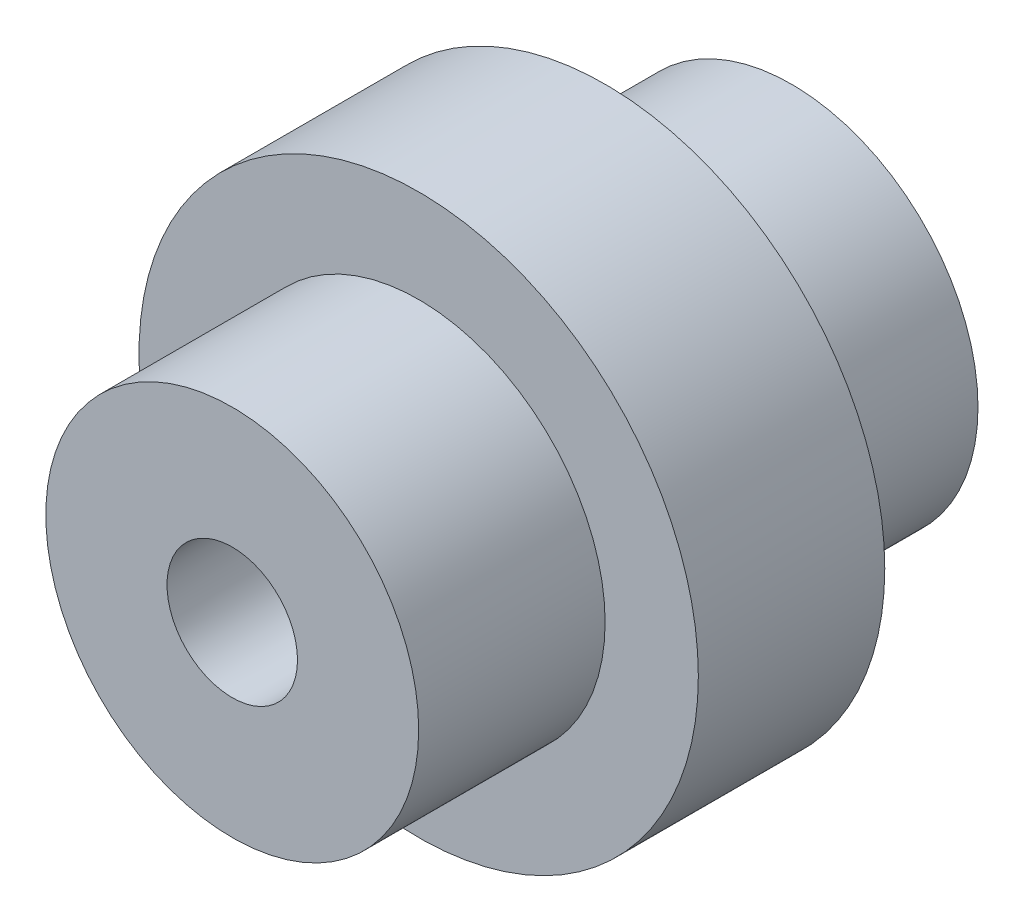
ISO-10303-21;
HEADER;
FILE_DESCRIPTION(('STEP AP214'),'2;1');
FILE_NAME('part.step','',(''),(''),'','','');
FILE_SCHEMA(('AUTOMOTIVE_DESIGN { 1 0 10303 214 1 1 1 1 }'));
ENDSEC;
DATA;
#1=APPLICATION_CONTEXT('core data for automotive mechanical design processes');
#2=APPLICATION_PROTOCOL_DEFINITION('international standard','automotive_design',2000,#1);
#3=PRODUCT_CONTEXT('',#1,'mechanical');
#4=PRODUCT('Part','Part','',(#3));
#5=PRODUCT_RELATED_PRODUCT_CATEGORY('part','',(#4));
#6=PRODUCT_DEFINITION_FORMATION('','',#4);
#7=PRODUCT_DEFINITION_CONTEXT('part definition',#1,'design');
#8=PRODUCT_DEFINITION('design','',#6,#7);
#9=PRODUCT_DEFINITION_SHAPE('','',#8);
#10=(LENGTH_UNIT() NAMED_UNIT(*) SI_UNIT(.MILLI.,.METRE.));
#11=(NAMED_UNIT(*) PLANE_ANGLE_UNIT() SI_UNIT($,.RADIAN.));
#12=(NAMED_UNIT(*) SI_UNIT($,.STERADIAN.) SOLID_ANGLE_UNIT());
#13=UNCERTAINTY_MEASURE_WITH_UNIT(LENGTH_MEASURE(1.E-05),#10,'distance_accuracy_value','');
#14=(GEOMETRIC_REPRESENTATION_CONTEXT(3) GLOBAL_UNCERTAINTY_ASSIGNED_CONTEXT((#13)) GLOBAL_UNIT_ASSIGNED_CONTEXT((#10,
#11,#12)) REPRESENTATION_CONTEXT('',''));
#15=CARTESIAN_POINT('',(0.,0.,0.));
#16=DIRECTION('',(0.,0.,1.));
#17=DIRECTION('',(1.,0.,0.));
#18=AXIS2_PLACEMENT_3D('',#15,#16,#17);
#19=CARTESIAN_POINT('',(0.,0.,29.));
#20=DIRECTION('',(0.,0.,1.));
#21=DIRECTION('',(1.,0.,0.));
#22=AXIS2_PLACEMENT_3D('',#19,#20,#21);
#23=CYLINDRICAL_SURFACE('',#22,5.99999999999999);
#24=CARTESIAN_POINT('',(0.,0.,29.));
#25=DIRECTION('',(0.,0.,1.));
#26=DIRECTION('',(1.,0.,0.));
#27=AXIS2_PLACEMENT_3D('',#24,#25,#26);
#28=CIRCLE('',#27,5.99999999999999);
#29=CARTESIAN_POINT('',(5.99999999999999,0.,29.));
#30=VERTEX_POINT('',#29);
#31=EDGE_CURVE('E44',#30,#30,#28,.T.);
#32=ORIENTED_EDGE('',*,*,#31,.T.);
#33=EDGE_LOOP('',(#32));
#34=FACE_BOUND('',#33,.T.);
#35=CARTESIAN_POINT('',(0.,0.,33.));
#36=DIRECTION('',(0.,0.,1.));
#37=DIRECTION('',(1.,0.,0.));
#38=AXIS2_PLACEMENT_3D('',#35,#36,#37);
#39=CIRCLE('',#38,5.99999999999999);
#40=CARTESIAN_POINT('',(5.99999999999999,0.,33.));
#41=VERTEX_POINT('',#40);
#42=EDGE_CURVE('E47',#41,#41,#39,.T.);
#43=ORIENTED_EDGE('',*,*,#42,.F.);
#44=EDGE_LOOP('',(#43));
#45=FACE_BOUND('',#44,.T.);
#46=ADVANCED_FACE('F39',(#34,#45),#23,.T.);
#47=CARTESIAN_POINT('',(0.,0.,29.));
#48=DIRECTION('',(0.,0.,1.));
#49=DIRECTION('',(1.,0.,0.));
#50=AXIS2_PLACEMENT_3D('',#47,#48,#49);
#51=PLANE('',#50);
#52=CARTESIAN_POINT('',(0.,0.,29.));
#53=DIRECTION('',(0.,0.,1.));
#54=DIRECTION('',(1.,0.,0.));
#55=AXIS2_PLACEMENT_3D('',#52,#53,#54);
#56=CIRCLE('',#55,4.00000000006799);
#57=CARTESIAN_POINT('',(4.00000000006799,0.,29.));
#58=VERTEX_POINT('',#57);
#59=EDGE_CURVE('E53',#58,#58,#56,.T.);
#60=ORIENTED_EDGE('',*,*,#59,.T.);
#61=EDGE_LOOP('',(#60));
#62=FACE_BOUND('',#61,.T.);
#63=ORIENTED_EDGE('',*,*,#31,.F.);
#64=EDGE_LOOP('',(#63));
#65=FACE_BOUND('',#64,.T.);
#66=ADVANCED_FACE('F94',(#62,#65),#51,.F.);
#67=CARTESIAN_POINT('',(0.,0.,33.));
#68=DIRECTION('',(0.,0.,1.));
#69=DIRECTION('',(1.,0.,0.));
#70=AXIS2_PLACEMENT_3D('',#67,#68,#69);
#71=PLANE('',#70);
#72=CARTESIAN_POINT('',(0.,0.,33.));
#73=DIRECTION('',(0.,0.,1.));
#74=DIRECTION('',(1.,0.,0.));
#75=AXIS2_PLACEMENT_3D('',#72,#73,#74);
#76=CIRCLE('',#75,4.00000000006799);
#77=CARTESIAN_POINT('',(4.00000000006799,0.,33.));
#78=VERTEX_POINT('',#77);
#79=EDGE_CURVE('E11',#78,#78,#76,.T.);
#80=ORIENTED_EDGE('',*,*,#79,.F.);
#81=EDGE_LOOP('',(#80));
#82=FACE_BOUND('',#81,.T.);
#83=ORIENTED_EDGE('',*,*,#42,.T.);
#84=EDGE_LOOP('',(#83));
#85=FACE_BOUND('',#84,.T.);
#86=ADVANCED_FACE('F78',(#82,#85),#71,.T.);
#87=CARTESIAN_POINT('',(0.,0.,37.));
#88=DIRECTION('',(0.,0.,1.));
#89=DIRECTION('',(1.,0.,0.));
#90=AXIS2_PLACEMENT_3D('',#87,#88,#89);
#91=PLANE('',#90);
#92=CARTESIAN_POINT('',(0.,0.,37.));
#93=DIRECTION('',(0.,0.,1.));
#94=DIRECTION('',(1.,0.,0.));
#95=AXIS2_PLACEMENT_3D('',#92,#93,#94);
#96=CIRCLE('',#95,1.4);
#97=CARTESIAN_POINT('',(1.4,0.,37.));
#98=VERTEX_POINT('',#97);
#99=EDGE_CURVE('E70',#98,#98,#96,.T.);
#100=ORIENTED_EDGE('',*,*,#99,.F.);
#101=EDGE_LOOP('',(#100));
#102=FACE_BOUND('',#101,.T.);
#103=CARTESIAN_POINT('',(0.,0.,37.));
#104=DIRECTION('',(0.,0.,1.));
#105=DIRECTION('',(1.,0.,0.));
#106=AXIS2_PLACEMENT_3D('',#103,#104,#105);
#107=CIRCLE('',#106,4.00000000006799);
#108=CARTESIAN_POINT('',(4.00000000006799,0.,37.));
#109=VERTEX_POINT('',#108);
#110=EDGE_CURVE('E62',#109,#109,#107,.T.);
#111=ORIENTED_EDGE('',*,*,#110,.T.);
#112=EDGE_LOOP('',(#111));
#113=FACE_BOUND('',#112,.T.);
#114=ADVANCED_FACE('F74',(#102,#113),#91,.T.);
#115=CARTESIAN_POINT('',(0.,0.,25.));
#116=DIRECTION('',(0.,0.,1.));
#117=DIRECTION('',(1.,0.,0.));
#118=AXIS2_PLACEMENT_3D('',#115,#116,#117);
#119=CYLINDRICAL_SURFACE('',#118,4.00000000006799);
#120=ORIENTED_EDGE('',*,*,#79,.T.);
#121=EDGE_LOOP('',(#120));
#122=FACE_BOUND('',#121,.T.);
#123=ORIENTED_EDGE('',*,*,#110,.F.);
#124=EDGE_LOOP('',(#123));
#125=FACE_BOUND('',#124,.T.);
#126=ADVANCED_FACE('F80',(#122,#125),#119,.T.);
#127=CARTESIAN_POINT('',(0.,0.,25.));
#128=DIRECTION('',(0.,0.,1.));
#129=DIRECTION('',(1.,0.,0.));
#130=AXIS2_PLACEMENT_3D('',#127,#128,#129);
#131=CIRCLE('',#130,4.00000000006799);
#132=CARTESIAN_POINT('',(4.00000000006799,0.,25.));
#133=VERTEX_POINT('',#132);
#134=EDGE_CURVE('E59',#133,#133,#131,.T.);
#135=ORIENTED_EDGE('',*,*,#134,.T.);
#136=EDGE_LOOP('',(#135));
#137=FACE_BOUND('',#136,.T.);
#138=ORIENTED_EDGE('',*,*,#59,.F.);
#139=EDGE_LOOP('',(#138));
#140=FACE_BOUND('',#139,.T.);
#141=ADVANCED_FACE('F81',(#137,#140),#119,.T.);
#142=CARTESIAN_POINT('',(0.,0.,25.));
#143=DIRECTION('',(0.,0.,1.));
#144=DIRECTION('',(1.,0.,0.));
#145=AXIS2_PLACEMENT_3D('',#142,#143,#144);
#146=PLANE('',#145);
#147=CARTESIAN_POINT('',(0.,0.,25.));
#148=DIRECTION('',(0.,0.,1.));
#149=DIRECTION('',(1.,0.,0.));
#150=AXIS2_PLACEMENT_3D('',#147,#148,#149);
#151=CIRCLE('',#150,1.46);
#152=CARTESIAN_POINT('',(1.46,0.,25.));
#153=VERTEX_POINT('',#152);
#154=EDGE_CURVE('E64',#153,#153,#151,.T.);
#155=ORIENTED_EDGE('',*,*,#154,.T.);
#156=EDGE_LOOP('',(#155));
#157=FACE_BOUND('',#156,.T.);
#158=ORIENTED_EDGE('',*,*,#134,.F.);
#159=EDGE_LOOP('',(#158));
#160=FACE_BOUND('',#159,.T.);
#161=ADVANCED_FACE('F90',(#157,#160),#146,.F.);
#162=CARTESIAN_POINT('',(0.,0.,37.));
#163=DIRECTION('',(0.,0.,-1.));
#164=DIRECTION('',(-1.,0.,0.));
#165=AXIS2_PLACEMENT_3D('',#162,#163,#164);
#166=CONICAL_SURFACE('',#165,1.4,0.00499995833395832);
#167=ORIENTED_EDGE('',*,*,#99,.T.);
#168=EDGE_LOOP('',(#167));
#169=FACE_BOUND('',#168,.T.);
#170=ORIENTED_EDGE('',*,*,#154,.F.);
#171=EDGE_LOOP('',(#170));
#172=FACE_BOUND('',#171,.T.);
#173=ADVANCED_FACE('F72',(#169,#172),#166,.F.);
#174=CLOSED_SHELL('',(#46,#66,#86,#114,#126,#141,#161,#173));
#175=MANIFOLD_SOLID_BREP('B2',#174);
#176=ADVANCED_BREP_SHAPE_REPRESENTATION('',(#18,#175),#14);
#177=SHAPE_DEFINITION_REPRESENTATION(#9,#176);
ENDSEC;
END-ISO-10303-21;
